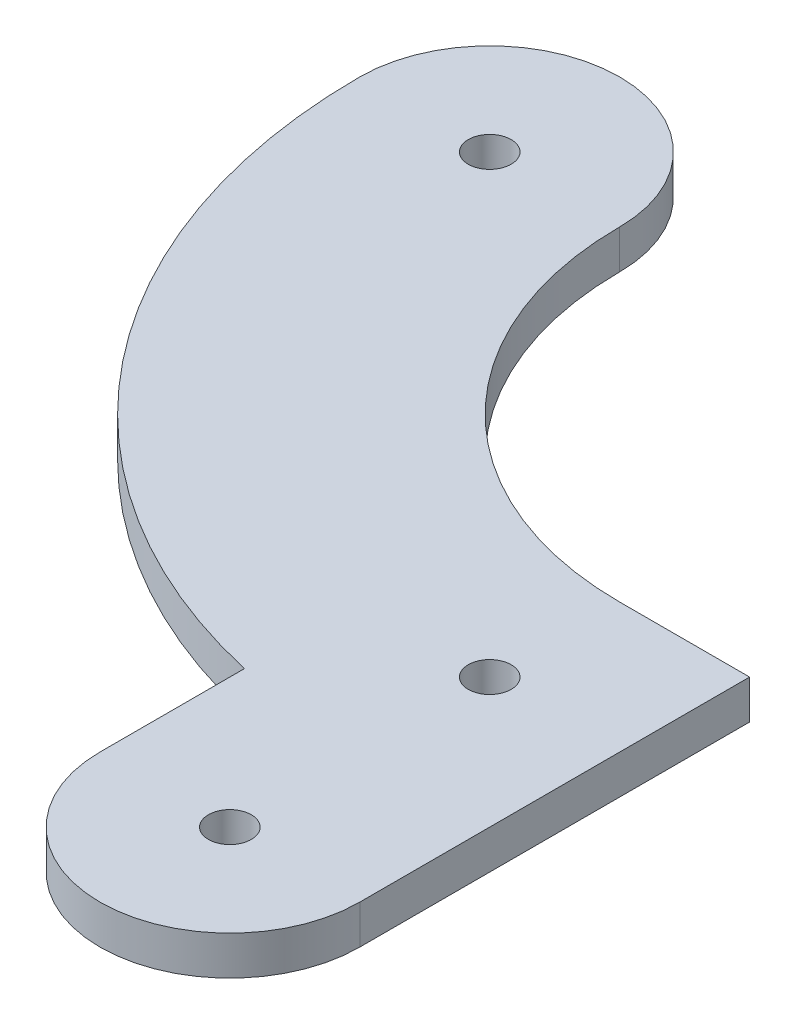
ISO-10303-21;
HEADER;
FILE_DESCRIPTION(('STEP AP214'),'2;1');
FILE_NAME('part.step','',(''),(''),'','','');
FILE_SCHEMA(('AUTOMOTIVE_DESIGN { 1 0 10303 214 1 1 1 1 }'));
ENDSEC;
DATA;
#1=APPLICATION_CONTEXT('core data for automotive mechanical design processes');
#2=APPLICATION_PROTOCOL_DEFINITION('international standard','automotive_design',2000,#1);
#3=PRODUCT_CONTEXT('',#1,'mechanical');
#4=PRODUCT('Part','Part','',(#3));
#5=PRODUCT_RELATED_PRODUCT_CATEGORY('part','',(#4));
#6=PRODUCT_DEFINITION_FORMATION('','',#4);
#7=PRODUCT_DEFINITION_CONTEXT('part definition',#1,'design');
#8=PRODUCT_DEFINITION('design','',#6,#7);
#9=PRODUCT_DEFINITION_SHAPE('','',#8);
#10=(LENGTH_UNIT() NAMED_UNIT(*) SI_UNIT(.MILLI.,.METRE.));
#11=(NAMED_UNIT(*) PLANE_ANGLE_UNIT() SI_UNIT($,.RADIAN.));
#12=(NAMED_UNIT(*) SI_UNIT($,.STERADIAN.) SOLID_ANGLE_UNIT());
#13=UNCERTAINTY_MEASURE_WITH_UNIT(LENGTH_MEASURE(1.E-05),#10,'distance_accuracy_value','');
#14=(GEOMETRIC_REPRESENTATION_CONTEXT(3) GLOBAL_UNCERTAINTY_ASSIGNED_CONTEXT((#13)) GLOBAL_UNIT_ASSIGNED_CONTEXT((#10,
#11,#12)) REPRESENTATION_CONTEXT('',''));
#15=CARTESIAN_POINT('',(0.,0.,0.));
#16=DIRECTION('',(0.,0.,1.));
#17=DIRECTION('',(1.,0.,0.));
#18=AXIS2_PLACEMENT_3D('',#15,#16,#17);
#19=CARTESIAN_POINT('',(0.,3.,0.));
#20=DIRECTION('',(0.,-1.,0.));
#21=DIRECTION('',(0.,0.,-1.));
#22=AXIS2_PLACEMENT_3D('',#19,#20,#21);
#23=PLANE('',#22);
#24=CARTESIAN_POINT('',(0.,3.,0.));
#25=DIRECTION('',(0.,1.,0.));
#26=DIRECTION('',(0.,0.,-1.));
#27=AXIS2_PLACEMENT_3D('',#24,#25,#26);
#28=CIRCLE('',#27,10.);
#29=CARTESIAN_POINT('',(-10.,3.,0.));
#30=VERTEX_POINT('',#29);
#31=CARTESIAN_POINT('',(10.,3.,0.));
#32=VERTEX_POINT('',#31);
#33=EDGE_CURVE('E138',#30,#32,#28,.T.);
#34=ORIENTED_EDGE('',*,*,#33,.T.);
#35=DIRECTION('',(0.,0.,-1.));
#36=VECTOR('',#35,1.);
#37=CARTESIAN_POINT('',(10.,3.,0.));
#38=LINE('',#37,#36);
#39=CARTESIAN_POINT('',(10.,3.,-30.));
#40=VERTEX_POINT('',#39);
#41=EDGE_CURVE('E91',#32,#40,#38,.T.);
#42=ORIENTED_EDGE('',*,*,#41,.T.);
#43=DIRECTION('',(-1.,0.,0.));
#44=VECTOR('',#43,1.);
#45=CARTESIAN_POINT('',(0.,3.,-30.));
#46=LINE('',#45,#44);
#47=CARTESIAN_POINT('',(0.,3.,-30.));
#48=VERTEX_POINT('',#47);
#49=EDGE_CURVE('E150',#40,#48,#46,.T.);
#50=ORIENTED_EDGE('',*,*,#49,.T.);
#51=CARTESIAN_POINT('',(0.,3.,-55.));
#52=DIRECTION('',(0.,-1.,0.));
#53=DIRECTION('',(0.,0.,-1.));
#54=AXIS2_PLACEMENT_3D('',#51,#52,#53);
#55=CIRCLE('',#54,25.);
#56=CARTESIAN_POINT('',(-25.,3.,-55.));
#57=VERTEX_POINT('',#56);
#58=EDGE_CURVE('E107',#48,#57,#55,.T.);
#59=ORIENTED_EDGE('',*,*,#58,.T.);
#60=CARTESIAN_POINT('',(-35.,3.,-55.));
#61=DIRECTION('',(0.,1.,0.));
#62=DIRECTION('',(0.,0.,1.));
#63=AXIS2_PLACEMENT_3D('',#60,#61,#62);
#64=CIRCLE('',#63,10.);
#65=CARTESIAN_POINT('',(-45.,3.,-55.));
#66=VERTEX_POINT('',#65);
#67=EDGE_CURVE('E101',#57,#66,#64,.T.);
#68=ORIENTED_EDGE('',*,*,#67,.T.);
#69=CARTESIAN_POINT('',(0.,3.,-55.));
#70=DIRECTION('',(0.,1.,0.));
#71=DIRECTION('',(0.,0.,-1.));
#72=AXIS2_PLACEMENT_3D('',#69,#70,#71);
#73=CIRCLE('',#72,45.);
#74=CARTESIAN_POINT('',(-10.,3.,-11.1251780630394));
#75=VERTEX_POINT('',#74);
#76=EDGE_CURVE('E105',#66,#75,#73,.T.);
#77=ORIENTED_EDGE('',*,*,#76,.T.);
#78=DIRECTION('',(0.,0.,1.));
#79=VECTOR('',#78,1.);
#80=CARTESIAN_POINT('',(-10.,3.,0.));
#81=LINE('',#80,#79);
#82=EDGE_CURVE('E51',#75,#30,#81,.T.);
#83=ORIENTED_EDGE('',*,*,#82,.T.);
#84=EDGE_LOOP('',(#34,#42,#50,#59,#68,#77,#83));
#85=FACE_BOUND('',#84,.T.);
#86=CARTESIAN_POINT('',(-35.,3.,-55.));
#87=DIRECTION('',(0.,1.,0.));
#88=DIRECTION('',(0.,0.,1.));
#89=AXIS2_PLACEMENT_3D('',#86,#87,#88);
#90=CIRCLE('',#89,1.65);
#91=CARTESIAN_POINT('',(-35.,3.,-53.35));
#92=VERTEX_POINT('',#91);
#93=EDGE_CURVE('E129',#92,#92,#90,.T.);
#94=ORIENTED_EDGE('',*,*,#93,.F.);
#95=EDGE_LOOP('',(#94));
#96=FACE_BOUND('',#95,.T.);
#97=CARTESIAN_POINT('',(0.,3.,-20.));
#98=DIRECTION('',(0.,1.,0.));
#99=DIRECTION('',(0.,0.,1.));
#100=AXIS2_PLACEMENT_3D('',#97,#98,#99);
#101=CIRCLE('',#100,1.65);
#102=CARTESIAN_POINT('',(0.,3.,-18.35));
#103=VERTEX_POINT('',#102);
#104=EDGE_CURVE('E165',#103,#103,#101,.T.);
#105=ORIENTED_EDGE('',*,*,#104,.F.);
#106=EDGE_LOOP('',(#105));
#107=FACE_BOUND('',#106,.T.);
#108=CARTESIAN_POINT('',(0.,3.,0.));
#109=DIRECTION('',(0.,1.,0.));
#110=DIRECTION('',(0.,0.,1.));
#111=AXIS2_PLACEMENT_3D('',#108,#109,#110);
#112=CIRCLE('',#111,1.65);
#113=CARTESIAN_POINT('',(0.,3.,1.65));
#114=VERTEX_POINT('',#113);
#115=EDGE_CURVE('E171',#114,#114,#112,.T.);
#116=ORIENTED_EDGE('',*,*,#115,.F.);
#117=EDGE_LOOP('',(#116));
#118=FACE_BOUND('',#117,.T.);
#119=ADVANCED_FACE('F34',(#85,#96,#107,#118),#23,.F.);
#120=CARTESIAN_POINT('',(0.,0.,0.));
#121=DIRECTION('',(0.,-1.,0.));
#122=DIRECTION('',(0.,0.,-1.));
#123=AXIS2_PLACEMENT_3D('',#120,#121,#122);
#124=PLANE('',#123);
#125=CARTESIAN_POINT('',(0.,0.,-20.));
#126=DIRECTION('',(0.,1.,0.));
#127=DIRECTION('',(0.,0.,1.));
#128=AXIS2_PLACEMENT_3D('',#125,#126,#127);
#129=CIRCLE('',#128,1.65);
#130=CARTESIAN_POINT('',(0.,0.,-18.35));
#131=VERTEX_POINT('',#130);
#132=EDGE_CURVE('E168',#131,#131,#129,.T.);
#133=ORIENTED_EDGE('',*,*,#132,.T.);
#134=EDGE_LOOP('',(#133));
#135=FACE_BOUND('',#134,.T.);
#136=CARTESIAN_POINT('',(0.,0.,0.));
#137=DIRECTION('',(0.,1.,0.));
#138=DIRECTION('',(0.,0.,-1.));
#139=AXIS2_PLACEMENT_3D('',#136,#137,#138);
#140=CIRCLE('',#139,10.);
#141=CARTESIAN_POINT('',(-10.,0.,0.));
#142=VERTEX_POINT('',#141);
#143=CARTESIAN_POINT('',(10.,0.,0.));
#144=VERTEX_POINT('',#143);
#145=EDGE_CURVE('E125',#142,#144,#140,.T.);
#146=ORIENTED_EDGE('',*,*,#145,.F.);
#147=DIRECTION('',(0.,0.,1.));
#148=VECTOR('',#147,1.);
#149=CARTESIAN_POINT('',(-10.,0.,0.));
#150=LINE('',#149,#148);
#151=CARTESIAN_POINT('',(-10.,0.,-11.1251780630394));
#152=VERTEX_POINT('',#151);
#153=EDGE_CURVE('E83',#152,#142,#150,.T.);
#154=ORIENTED_EDGE('',*,*,#153,.F.);
#155=CARTESIAN_POINT('',(0.,0.,-55.));
#156=DIRECTION('',(0.,1.,0.));
#157=DIRECTION('',(0.,0.,-1.));
#158=AXIS2_PLACEMENT_3D('',#155,#156,#157);
#159=CIRCLE('',#158,45.);
#160=CARTESIAN_POINT('',(-45.,0.,-55.));
#161=VERTEX_POINT('',#160);
#162=EDGE_CURVE('E77',#161,#152,#159,.T.);
#163=ORIENTED_EDGE('',*,*,#162,.F.);
#164=CARTESIAN_POINT('',(-35.,0.,-55.));
#165=DIRECTION('',(0.,1.,0.));
#166=DIRECTION('',(0.,0.,1.));
#167=AXIS2_PLACEMENT_3D('',#164,#165,#166);
#168=CIRCLE('',#167,10.);
#169=CARTESIAN_POINT('',(-25.,0.,-55.));
#170=VERTEX_POINT('',#169);
#171=EDGE_CURVE('E115',#170,#161,#168,.T.);
#172=ORIENTED_EDGE('',*,*,#171,.F.);
#173=CARTESIAN_POINT('',(0.,0.,-55.));
#174=DIRECTION('',(0.,-1.,0.));
#175=DIRECTION('',(0.,0.,-1.));
#176=AXIS2_PLACEMENT_3D('',#173,#174,#175);
#177=CIRCLE('',#176,25.);
#178=CARTESIAN_POINT('',(0.,0.,-30.));
#179=VERTEX_POINT('',#178);
#180=EDGE_CURVE('E133',#179,#170,#177,.T.);
#181=ORIENTED_EDGE('',*,*,#180,.F.);
#182=DIRECTION('',(-1.,0.,0.));
#183=VECTOR('',#182,1.);
#184=CARTESIAN_POINT('',(0.,0.,-30.));
#185=LINE('',#184,#183);
#186=CARTESIAN_POINT('',(10.,0.,-30.));
#187=VERTEX_POINT('',#186);
#188=EDGE_CURVE('E131',#187,#179,#185,.T.);
#189=ORIENTED_EDGE('',*,*,#188,.F.);
#190=DIRECTION('',(0.,0.,-1.));
#191=VECTOR('',#190,1.);
#192=CARTESIAN_POINT('',(10.,0.,0.));
#193=LINE('',#192,#191);
#194=EDGE_CURVE('E128',#144,#187,#193,.T.);
#195=ORIENTED_EDGE('',*,*,#194,.F.);
#196=EDGE_LOOP('',(#146,#154,#163,#172,#181,#189,#195));
#197=FACE_BOUND('',#196,.T.);
#198=CARTESIAN_POINT('',(-35.,0.,-55.));
#199=DIRECTION('',(0.,1.,0.));
#200=DIRECTION('',(0.,0.,1.));
#201=AXIS2_PLACEMENT_3D('',#198,#199,#200);
#202=CIRCLE('',#201,1.65);
#203=CARTESIAN_POINT('',(-35.,0.,-53.35));
#204=VERTEX_POINT('',#203);
#205=EDGE_CURVE('E162',#204,#204,#202,.T.);
#206=ORIENTED_EDGE('',*,*,#205,.T.);
#207=EDGE_LOOP('',(#206));
#208=FACE_BOUND('',#207,.T.);
#209=CARTESIAN_POINT('',(0.,0.,0.));
#210=DIRECTION('',(0.,1.,0.));
#211=DIRECTION('',(0.,0.,1.));
#212=AXIS2_PLACEMENT_3D('',#209,#210,#211);
#213=CIRCLE('',#212,1.65);
#214=CARTESIAN_POINT('',(0.,0.,1.65));
#215=VERTEX_POINT('',#214);
#216=EDGE_CURVE('E174',#215,#215,#213,.T.);
#217=ORIENTED_EDGE('',*,*,#216,.T.);
#218=EDGE_LOOP('',(#217));
#219=FACE_BOUND('',#218,.T.);
#220=ADVANCED_FACE('F154',(#135,#197,#208,#219),#124,.T.);
#221=CARTESIAN_POINT('',(0.,3.,0.));
#222=DIRECTION('',(0.,-1.,0.));
#223=DIRECTION('',(0.,0.,-1.));
#224=AXIS2_PLACEMENT_3D('',#221,#222,#223);
#225=CYLINDRICAL_SURFACE('',#224,10.);
#226=ORIENTED_EDGE('',*,*,#145,.T.);
#227=DIRECTION('',(0.,-1.,0.));
#228=VECTOR('',#227,1.);
#229=CARTESIAN_POINT('',(10.,3.,0.));
#230=LINE('',#229,#228);
#231=EDGE_CURVE('E11',#32,#144,#230,.T.);
#232=ORIENTED_EDGE('',*,*,#231,.F.);
#233=ORIENTED_EDGE('',*,*,#33,.F.);
#234=DIRECTION('',(0.,-1.,0.));
#235=VECTOR('',#234,1.);
#236=CARTESIAN_POINT('',(-10.,3.,0.));
#237=LINE('',#236,#235);
#238=EDGE_CURVE('E121',#30,#142,#237,.T.);
#239=ORIENTED_EDGE('',*,*,#238,.T.);
#240=EDGE_LOOP('',(#226,#232,#233,#239));
#241=FACE_BOUND('',#240,.T.);
#242=ADVANCED_FACE('F36',(#241),#225,.T.);
#243=CARTESIAN_POINT('',(10.,3.,0.));
#244=DIRECTION('',(-1.,0.,0.));
#245=DIRECTION('',(0.,0.,1.));
#246=AXIS2_PLACEMENT_3D('',#243,#244,#245);
#247=PLANE('',#246);
#248=ORIENTED_EDGE('',*,*,#194,.T.);
#249=DIRECTION('',(0.,-1.,0.));
#250=VECTOR('',#249,1.);
#251=CARTESIAN_POINT('',(10.,3.,-30.));
#252=LINE('',#251,#250);
#253=EDGE_CURVE('E43',#40,#187,#252,.T.);
#254=ORIENTED_EDGE('',*,*,#253,.F.);
#255=ORIENTED_EDGE('',*,*,#41,.F.);
#256=ORIENTED_EDGE('',*,*,#231,.T.);
#257=EDGE_LOOP('',(#248,#254,#255,#256));
#258=FACE_BOUND('',#257,.T.);
#259=ADVANCED_FACE('F204',(#258),#247,.F.);
#260=CARTESIAN_POINT('',(0.,3.,-30.));
#261=DIRECTION('',(0.,0.,1.));
#262=DIRECTION('',(1.,0.,0.));
#263=AXIS2_PLACEMENT_3D('',#260,#261,#262);
#264=PLANE('',#263);
#265=ORIENTED_EDGE('',*,*,#188,.T.);
#266=DIRECTION('',(0.,-1.,0.));
#267=VECTOR('',#266,1.);
#268=CARTESIAN_POINT('',(0.,3.,-30.));
#269=LINE('',#268,#267);
#270=EDGE_CURVE('E142',#48,#179,#269,.T.);
#271=ORIENTED_EDGE('',*,*,#270,.F.);
#272=ORIENTED_EDGE('',*,*,#49,.F.);
#273=ORIENTED_EDGE('',*,*,#253,.T.);
#274=EDGE_LOOP('',(#265,#271,#272,#273));
#275=FACE_BOUND('',#274,.T.);
#276=ADVANCED_FACE('F148',(#275),#264,.F.);
#277=CARTESIAN_POINT('',(0.,3.,-55.));
#278=DIRECTION('',(0.,-1.,0.));
#279=DIRECTION('',(0.,0.,-1.));
#280=AXIS2_PLACEMENT_3D('',#277,#278,#279);
#281=CYLINDRICAL_SURFACE('',#280,25.);
#282=ORIENTED_EDGE('',*,*,#180,.T.);
#283=DIRECTION('',(0.,-1.,0.));
#284=VECTOR('',#283,1.);
#285=CARTESIAN_POINT('',(-25.,3.,-55.));
#286=LINE('',#285,#284);
#287=EDGE_CURVE('E116',#57,#170,#286,.T.);
#288=ORIENTED_EDGE('',*,*,#287,.F.);
#289=ORIENTED_EDGE('',*,*,#58,.F.);
#290=ORIENTED_EDGE('',*,*,#270,.T.);
#291=EDGE_LOOP('',(#282,#288,#289,#290));
#292=FACE_BOUND('',#291,.T.);
#293=ADVANCED_FACE('F157',(#292),#281,.F.);
#294=CARTESIAN_POINT('',(-35.,3.,-55.));
#295=DIRECTION('',(0.,-1.,0.));
#296=DIRECTION('',(0.,0.,-1.));
#297=AXIS2_PLACEMENT_3D('',#294,#295,#296);
#298=CYLINDRICAL_SURFACE('',#297,10.);
#299=ORIENTED_EDGE('',*,*,#171,.T.);
#300=DIRECTION('',(0.,-1.,0.));
#301=VECTOR('',#300,1.);
#302=CARTESIAN_POINT('',(-45.,3.,-55.));
#303=LINE('',#302,#301);
#304=EDGE_CURVE('E112',#66,#161,#303,.T.);
#305=ORIENTED_EDGE('',*,*,#304,.F.);
#306=ORIENTED_EDGE('',*,*,#67,.F.);
#307=ORIENTED_EDGE('',*,*,#287,.T.);
#308=EDGE_LOOP('',(#299,#305,#306,#307));
#309=FACE_BOUND('',#308,.T.);
#310=ADVANCED_FACE('F113',(#309),#298,.T.);
#311=CARTESIAN_POINT('',(0.,3.,-55.));
#312=DIRECTION('',(0.,-1.,0.));
#313=DIRECTION('',(0.,0.,-1.));
#314=AXIS2_PLACEMENT_3D('',#311,#312,#313);
#315=CYLINDRICAL_SURFACE('',#314,45.);
#316=ORIENTED_EDGE('',*,*,#162,.T.);
#317=DIRECTION('',(0.,-1.,0.));
#318=VECTOR('',#317,1.);
#319=CARTESIAN_POINT('',(-10.,3.,-11.1251780630394));
#320=LINE('',#319,#318);
#321=EDGE_CURVE('E117',#75,#152,#320,.T.);
#322=ORIENTED_EDGE('',*,*,#321,.F.);
#323=ORIENTED_EDGE('',*,*,#76,.F.);
#324=ORIENTED_EDGE('',*,*,#304,.T.);
#325=EDGE_LOOP('',(#316,#322,#323,#324));
#326=FACE_BOUND('',#325,.T.);
#327=ADVANCED_FACE('F119',(#326),#315,.T.);
#328=CARTESIAN_POINT('',(-10.,3.,0.));
#329=DIRECTION('',(1.,0.,0.));
#330=DIRECTION('',(0.,0.,-1.));
#331=AXIS2_PLACEMENT_3D('',#328,#329,#330);
#332=PLANE('',#331);
#333=ORIENTED_EDGE('',*,*,#153,.T.);
#334=ORIENTED_EDGE('',*,*,#238,.F.);
#335=ORIENTED_EDGE('',*,*,#82,.F.);
#336=ORIENTED_EDGE('',*,*,#321,.T.);
#337=EDGE_LOOP('',(#333,#334,#335,#336));
#338=FACE_BOUND('',#337,.T.);
#339=ADVANCED_FACE('F194',(#338),#332,.F.);
#340=CARTESIAN_POINT('',(-35.,3.,-55.));
#341=DIRECTION('',(0.,-1.,0.));
#342=DIRECTION('',(0.,0.,-1.));
#343=AXIS2_PLACEMENT_3D('',#340,#341,#342);
#344=CYLINDRICAL_SURFACE('',#343,1.65);
#345=ORIENTED_EDGE('',*,*,#93,.T.);
#346=EDGE_LOOP('',(#345));
#347=FACE_BOUND('',#346,.T.);
#348=ORIENTED_EDGE('',*,*,#205,.F.);
#349=EDGE_LOOP('',(#348));
#350=FACE_BOUND('',#349,.T.);
#351=ADVANCED_FACE('F191',(#347,#350),#344,.F.);
#352=CARTESIAN_POINT('',(0.,3.,-20.));
#353=DIRECTION('',(0.,-1.,0.));
#354=DIRECTION('',(0.,0.,-1.));
#355=AXIS2_PLACEMENT_3D('',#352,#353,#354);
#356=CYLINDRICAL_SURFACE('',#355,1.65);
#357=ORIENTED_EDGE('',*,*,#104,.T.);
#358=EDGE_LOOP('',(#357));
#359=FACE_BOUND('',#358,.T.);
#360=ORIENTED_EDGE('',*,*,#132,.F.);
#361=EDGE_LOOP('',(#360));
#362=FACE_BOUND('',#361,.T.);
#363=ADVANCED_FACE('F263',(#359,#362),#356,.F.);
#364=CARTESIAN_POINT('',(0.,3.,0.));
#365=DIRECTION('',(0.,-1.,0.));
#366=DIRECTION('',(0.,0.,-1.));
#367=AXIS2_PLACEMENT_3D('',#364,#365,#366);
#368=CYLINDRICAL_SURFACE('',#367,1.65);
#369=ORIENTED_EDGE('',*,*,#115,.T.);
#370=EDGE_LOOP('',(#369));
#371=FACE_BOUND('',#370,.T.);
#372=ORIENTED_EDGE('',*,*,#216,.F.);
#373=EDGE_LOOP('',(#372));
#374=FACE_BOUND('',#373,.T.);
#375=ADVANCED_FACE('F180',(#371,#374),#368,.F.);
#376=CLOSED_SHELL('',(#119,#220,#242,#259,#276,#293,#310,#327,#339,#351,#363,#375));
#377=MANIFOLD_SOLID_BREP('B2',#376);
#378=ADVANCED_BREP_SHAPE_REPRESENTATION('',(#18,#377),#14);
#379=SHAPE_DEFINITION_REPRESENTATION(#9,#378);
ENDSEC;
END-ISO-10303-21;
